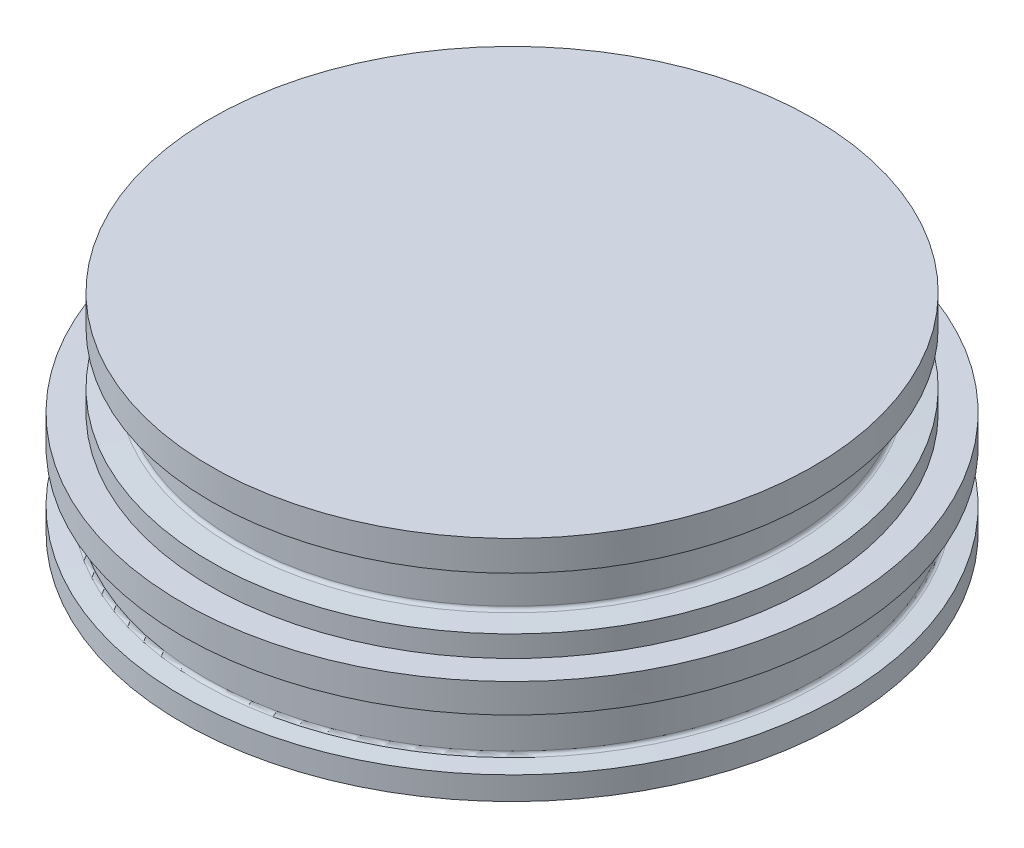
ISO-10303-21;
HEADER;
FILE_DESCRIPTION(('STEP AP214'),'2;1');
FILE_NAME('part.step','',(''),(''),'','','');
FILE_SCHEMA(('AUTOMOTIVE_DESIGN { 1 0 10303 214 1 1 1 1 }'));
ENDSEC;
DATA;
#1=APPLICATION_CONTEXT('core data for automotive mechanical design processes');
#2=APPLICATION_PROTOCOL_DEFINITION('international standard','automotive_design',2000,#1);
#3=PRODUCT_CONTEXT('',#1,'mechanical');
#4=PRODUCT('Part','Part','',(#3));
#5=PRODUCT_RELATED_PRODUCT_CATEGORY('part','',(#4));
#6=PRODUCT_DEFINITION_FORMATION('','',#4);
#7=PRODUCT_DEFINITION_CONTEXT('part definition',#1,'design');
#8=PRODUCT_DEFINITION('design','',#6,#7);
#9=PRODUCT_DEFINITION_SHAPE('','',#8);
#10=(LENGTH_UNIT() NAMED_UNIT(*) SI_UNIT(.MILLI.,.METRE.));
#11=(NAMED_UNIT(*) PLANE_ANGLE_UNIT() SI_UNIT($,.RADIAN.));
#12=(NAMED_UNIT(*) SI_UNIT($,.STERADIAN.) SOLID_ANGLE_UNIT());
#13=UNCERTAINTY_MEASURE_WITH_UNIT(LENGTH_MEASURE(1.E-05),#10,'distance_accuracy_value','');
#14=(GEOMETRIC_REPRESENTATION_CONTEXT(3) GLOBAL_UNCERTAINTY_ASSIGNED_CONTEXT((#13)) GLOBAL_UNIT_ASSIGNED_CONTEXT((#10,
#11,#12)) REPRESENTATION_CONTEXT('',''));
#15=CARTESIAN_POINT('',(0.,0.,0.));
#16=DIRECTION('',(0.,0.,1.));
#17=DIRECTION('',(1.,0.,0.));
#18=AXIS2_PLACEMENT_3D('',#15,#16,#17);
#19=CARTESIAN_POINT('',(0.,0.,0.));
#20=DIRECTION('',(0.,-1.,0.));
#21=DIRECTION('',(0.,0.,-1.));
#22=AXIS2_PLACEMENT_3D('',#19,#20,#21);
#23=CYLINDRICAL_SURFACE('',#22,22.0853);
#24=CARTESIAN_POINT('',(0.,-6.06148321730033,0.));
#25=DIRECTION('',(0.,-1.,0.));
#26=DIRECTION('',(0.,0.,-1.));
#27=AXIS2_PLACEMENT_3D('',#24,#25,#26);
#28=CIRCLE('',#27,22.0853);
#29=CARTESIAN_POINT('',(0.,-6.06148321730033,-22.0853));
#30=VERTEX_POINT('',#29);
#31=EDGE_CURVE('E39',#30,#30,#28,.T.);
#32=ORIENTED_EDGE('',*,*,#31,.T.);
#33=EDGE_LOOP('',(#32));
#34=FACE_BOUND('',#33,.T.);
#35=CARTESIAN_POINT('',(0.,-7.62,0.));
#36=DIRECTION('',(0.,-1.,0.));
#37=DIRECTION('',(0.,0.,-1.));
#38=AXIS2_PLACEMENT_3D('',#35,#36,#37);
#39=CIRCLE('',#38,22.0853);
#40=CARTESIAN_POINT('',(0.,-7.62,-22.0853));
#41=VERTEX_POINT('',#40);
#42=EDGE_CURVE('E43',#41,#41,#39,.T.);
#43=ORIENTED_EDGE('',*,*,#42,.F.);
#44=EDGE_LOOP('',(#43));
#45=FACE_BOUND('',#44,.T.);
#46=ADVANCED_FACE('F35',(#34,#45),#23,.T.);
#47=CARTESIAN_POINT('',(-22.0853,-7.62,0.));
#48=DIRECTION('',(0.,-1.,0.));
#49=DIRECTION('',(0.,0.,-1.));
#50=AXIS2_PLACEMENT_3D('',#47,#48,#49);
#51=PLANE('',#50);
#52=CARTESIAN_POINT('',(0.,-7.62,0.));
#53=DIRECTION('',(0.,-1.,0.));
#54=DIRECTION('',(0.,0.,-1.));
#55=AXIS2_PLACEMENT_3D('',#52,#53,#54);
#56=CIRCLE('',#55,24.1554);
#57=CARTESIAN_POINT('',(0.,-7.62,-24.1554));
#58=VERTEX_POINT('',#57);
#59=EDGE_CURVE('E48',#58,#58,#56,.T.);
#60=ORIENTED_EDGE('',*,*,#59,.F.);
#61=EDGE_LOOP('',(#60));
#62=FACE_BOUND('',#61,.T.);
#63=ORIENTED_EDGE('',*,*,#42,.T.);
#64=EDGE_LOOP('',(#63));
#65=FACE_BOUND('',#64,.T.);
#66=ADVANCED_FACE('F92',(#62,#65),#51,.F.);
#67=CARTESIAN_POINT('',(0.,0.,0.));
#68=DIRECTION('',(0.,-1.,0.));
#69=DIRECTION('',(0.,0.,-1.));
#70=AXIS2_PLACEMENT_3D('',#67,#68,#69);
#71=CYLINDRICAL_SURFACE('',#70,24.1554);
#72=CARTESIAN_POINT('',(0.,-9.74820445114807,0.));
#73=DIRECTION('',(0.,1.,0.));
#74=DIRECTION('',(0.,0.,1.));
#75=AXIS2_PLACEMENT_3D('',#72,#73,#74);
#76=CIRCLE('',#75,24.1554);
#77=CARTESIAN_POINT('',(0.,-9.74820445114807,24.1554));
#78=VERTEX_POINT('',#77);
#79=EDGE_CURVE('E52',#78,#78,#76,.T.);
#80=ORIENTED_EDGE('',*,*,#79,.T.);
#81=EDGE_LOOP('',(#80));
#82=FACE_BOUND('',#81,.T.);
#83=ORIENTED_EDGE('',*,*,#59,.T.);
#84=EDGE_LOOP('',(#83));
#85=FACE_BOUND('',#84,.T.);
#86=ADVANCED_FACE('F90',(#82,#85),#71,.T.);
#87=CARTESIAN_POINT('',(0.,-13.592521164845,0.));
#88=DIRECTION('',(0.,-1.,0.));
#89=DIRECTION('',(0.,0.,-1.));
#90=AXIS2_PLACEMENT_3D('',#87,#88,#89);
#91=CONICAL_SURFACE('',#90,24.6888,1.48352986419518);
#92=CARTESIAN_POINT('',(0.,-13.4250295814342,0.));
#93=DIRECTION('',(0.,1.,0.));
#94=DIRECTION('',(0.,0.,1.));
#95=AXIS2_PLACEMENT_3D('',#92,#93,#94);
#96=CIRCLE('',#95,22.7743624413421);
#97=CARTESIAN_POINT('',(0.,-13.4250295814342,22.7743624413421));
#98=VERTEX_POINT('',#97);
#99=EDGE_CURVE('E56',#98,#98,#96,.T.);
#100=ORIENTED_EDGE('',*,*,#99,.F.);
#101=EDGE_LOOP('',(#100));
#102=FACE_BOUND('',#101,.T.);
#103=CARTESIAN_POINT('',(0.,-13.5458547117202,0.));
#104=DIRECTION('',(0.,-1.,0.));
#105=DIRECTION('',(0.,0.,-1.));
#106=AXIS2_PLACEMENT_3D('',#103,#104,#105);
#107=CIRCLE('',#106,24.1554);
#108=CARTESIAN_POINT('',(0.,-13.5458547117202,-24.1554));
#109=VERTEX_POINT('',#108);
#110=EDGE_CURVE('E55',#109,#109,#107,.T.);
#111=ORIENTED_EDGE('',*,*,#110,.F.);
#112=EDGE_LOOP('',(#111));
#113=FACE_BOUND('',#112,.T.);
#114=ADVANCED_FACE('F149',(#102,#113),#91,.T.);
#115=CARTESIAN_POINT('',(0.,-9.86902958143415,0.));
#116=DIRECTION('',(0.,1.,0.));
#117=DIRECTION('',(0.,0.,1.));
#118=AXIS2_PLACEMENT_3D('',#115,#116,#117);
#119=CONICAL_SURFACE('',#118,22.7743624413421,1.48352986419518);
#120=CARTESIAN_POINT('',(0.,-9.86902958143415,0.));
#121=DIRECTION('',(0.,1.,0.));
#122=DIRECTION('',(0.,0.,1.));
#123=AXIS2_PLACEMENT_3D('',#120,#121,#122);
#124=CIRCLE('',#123,22.7743624413421);
#125=CARTESIAN_POINT('',(0.,-9.86902958143415,22.7743624413421));
#126=VERTEX_POINT('',#125);
#127=EDGE_CURVE('E81',#126,#126,#124,.T.);
#128=ORIENTED_EDGE('',*,*,#127,.T.);
#129=EDGE_LOOP('',(#128));
#130=FACE_BOUND('',#129,.T.);
#131=ORIENTED_EDGE('',*,*,#79,.F.);
#132=EDGE_LOOP('',(#131));
#133=FACE_BOUND('',#132,.T.);
#134=ADVANCED_FACE('F146',(#130,#133),#119,.T.);
#135=CARTESIAN_POINT('',(0.,-13.1719961281189,0.));
#136=DIRECTION('',(0.,1.,0.));
#137=DIRECTION('',(0.,0.,1.));
#138=AXIS2_PLACEMENT_3D('',#135,#136,#137);
#139=TOROIDAL_SURFACE('',#138,22.7965,0.254);
#140=CARTESIAN_POINT('',(0.,-13.1719961281189,0.));
#141=DIRECTION('',(0.,1.,0.));
#142=DIRECTION('',(0.,0.,1.));
#143=AXIS2_PLACEMENT_3D('',#140,#141,#142);
#144=CIRCLE('',#143,22.5425);
#145=CARTESIAN_POINT('',(0.,-13.1719961281189,22.5425));
#146=VERTEX_POINT('',#145);
#147=EDGE_CURVE('E65',#146,#146,#144,.T.);
#148=ORIENTED_EDGE('',*,*,#147,.F.);
#149=EDGE_LOOP('',(#148));
#150=FACE_BOUND('',#149,.T.);
#151=ORIENTED_EDGE('',*,*,#99,.T.);
#152=EDGE_LOOP('',(#151));
#153=FACE_BOUND('',#152,.T.);
#154=ADVANCED_FACE('F144',(#150,#153),#139,.F.);
#155=CARTESIAN_POINT('',(0.,-10.1220630347495,0.));
#156=DIRECTION('',(0.,1.,0.));
#157=DIRECTION('',(0.,0.,1.));
#158=AXIS2_PLACEMENT_3D('',#155,#156,#157);
#159=TOROIDAL_SURFACE('',#158,22.7965,0.254);
#160=ORIENTED_EDGE('',*,*,#127,.F.);
#161=EDGE_LOOP('',(#160));
#162=FACE_BOUND('',#161,.T.);
#163=CARTESIAN_POINT('',(0.,-10.1220630347495,0.));
#164=DIRECTION('',(0.,1.,0.));
#165=DIRECTION('',(0.,0.,1.));
#166=AXIS2_PLACEMENT_3D('',#163,#164,#165);
#167=CIRCLE('',#166,22.5425);
#168=CARTESIAN_POINT('',(0.,-10.1220630347495,22.5425));
#169=VERTEX_POINT('',#168);
#170=EDGE_CURVE('E78',#169,#169,#167,.T.);
#171=ORIENTED_EDGE('',*,*,#170,.T.);
#172=EDGE_LOOP('',(#171));
#173=FACE_BOUND('',#172,.T.);
#174=ADVANCED_FACE('F140',(#162,#173),#159,.F.);
#175=CARTESIAN_POINT('',(0.,-50.,0.));
#176=DIRECTION('',(0.,1.,0.));
#177=DIRECTION('',(0.,0.,1.));
#178=AXIS2_PLACEMENT_3D('',#175,#176,#177);
#179=CYLINDRICAL_SURFACE('',#178,22.5425);
#180=ORIENTED_EDGE('',*,*,#170,.F.);
#181=EDGE_LOOP('',(#180));
#182=FACE_BOUND('',#181,.T.);
#183=ORIENTED_EDGE('',*,*,#147,.T.);
#184=EDGE_LOOP('',(#183));
#185=FACE_BOUND('',#184,.T.);
#186=ADVANCED_FACE('F136',(#182,#185),#179,.T.);
#187=CARTESIAN_POINT('',(-24.1554,-15.24,0.));
#188=DIRECTION('',(0.,1.,0.));
#189=DIRECTION('',(0.,0.,1.));
#190=AXIS2_PLACEMENT_3D('',#187,#188,#189);
#191=PLANE('',#190);
#192=CARTESIAN_POINT('',(0.,-15.24,0.));
#193=DIRECTION('',(0.,-1.,0.));
#194=DIRECTION('',(0.,0.,-1.));
#195=AXIS2_PLACEMENT_3D('',#192,#193,#194);
#196=CIRCLE('',#195,24.1554);
#197=CARTESIAN_POINT('',(0.,-15.24,-24.1554));
#198=VERTEX_POINT('',#197);
#199=EDGE_CURVE('E58',#198,#198,#196,.T.);
#200=ORIENTED_EDGE('',*,*,#199,.T.);
#201=EDGE_LOOP('',(#200));
#202=FACE_BOUND('',#201,.T.);
#203=ADVANCED_FACE('F139',(#202),#191,.F.);
#204=ORIENTED_EDGE('',*,*,#110,.T.);
#205=EDGE_LOOP('',(#204));
#206=FACE_BOUND('',#205,.T.);
#207=ORIENTED_EDGE('',*,*,#199,.F.);
#208=EDGE_LOOP('',(#207));
#209=FACE_BOUND('',#208,.T.);
#210=ADVANCED_FACE('F131',(#206,#209),#71,.T.);
#211=CARTESIAN_POINT('',(0.,-6.08148312578236,0.));
#212=DIRECTION('',(0.,-1.,0.));
#213=DIRECTION('',(0.,0.,-1.));
#214=AXIS2_PLACEMENT_3D('',#211,#212,#213);
#215=CONICAL_SURFACE('',#214,22.3139,1.48352986419518);
#216=CARTESIAN_POINT('',(0.,-5.91399154237154,0.));
#217=DIRECTION('',(0.,1.,0.));
#218=DIRECTION('',(0.,0.,1.));
#219=AXIS2_PLACEMENT_3D('',#216,#217,#218);
#220=CIRCLE('',#219,20.3994624413421);
#221=CARTESIAN_POINT('',(0.,-5.91399154237154,20.3994624413421));
#222=VERTEX_POINT('',#221);
#223=EDGE_CURVE('E61',#222,#222,#220,.T.);
#224=ORIENTED_EDGE('',*,*,#223,.F.);
#225=EDGE_LOOP('',(#224));
#226=FACE_BOUND('',#225,.T.);
#227=ORIENTED_EDGE('',*,*,#31,.F.);
#228=EDGE_LOOP('',(#227));
#229=FACE_BOUND('',#228,.T.);
#230=ADVANCED_FACE('F127',(#226,#229),#215,.T.);
#231=CARTESIAN_POINT('',(0.,-2.35799154237154,0.));
#232=DIRECTION('',(0.,1.,0.));
#233=DIRECTION('',(0.,0.,1.));
#234=AXIS2_PLACEMENT_3D('',#231,#232,#233);
#235=CONICAL_SURFACE('',#234,20.3994624413421,1.48352986419518);
#236=CARTESIAN_POINT('',(0.,-2.35799154237154,0.));
#237=DIRECTION('',(0.,1.,0.));
#238=DIRECTION('',(0.,0.,1.));
#239=AXIS2_PLACEMENT_3D('',#236,#237,#238);
#240=CIRCLE('',#239,20.3994624413421);
#241=CARTESIAN_POINT('',(0.,-2.35799154237154,20.3994624413421));
#242=VERTEX_POINT('',#241);
#243=EDGE_CURVE('E67',#242,#242,#240,.T.);
#244=ORIENTED_EDGE('',*,*,#243,.T.);
#245=EDGE_LOOP('',(#244));
#246=FACE_BOUND('',#245,.T.);
#247=CARTESIAN_POINT('',(0.,-2.21049986744275,0.));
#248=DIRECTION('',(0.,1.,0.));
#249=DIRECTION('',(0.,0.,1.));
#250=AXIS2_PLACEMENT_3D('',#247,#248,#249);
#251=CIRCLE('',#250,22.0853);
#252=CARTESIAN_POINT('',(0.,-2.21049986744275,22.0853));
#253=VERTEX_POINT('',#252);
#254=EDGE_CURVE('E59',#253,#253,#251,.T.);
#255=ORIENTED_EDGE('',*,*,#254,.F.);
#256=EDGE_LOOP('',(#255));
#257=FACE_BOUND('',#256,.T.);
#258=ADVANCED_FACE('F124',(#246,#257),#235,.T.);
#259=CARTESIAN_POINT('',(0.,-5.66095808905624,0.));
#260=DIRECTION('',(0.,1.,0.));
#261=DIRECTION('',(0.,0.,1.));
#262=AXIS2_PLACEMENT_3D('',#259,#260,#261);
#263=TOROIDAL_SURFACE('',#262,20.4216,0.254000000000001);
#264=CARTESIAN_POINT('',(0.,-5.66095808905624,0.));
#265=DIRECTION('',(0.,1.,0.));
#266=DIRECTION('',(0.,0.,1.));
#267=AXIS2_PLACEMENT_3D('',#264,#265,#266);
#268=CIRCLE('',#267,20.1676);
#269=CARTESIAN_POINT('',(0.,-5.66095808905624,20.1676));
#270=VERTEX_POINT('',#269);
#271=EDGE_CURVE('E273',#270,#270,#268,.T.);
#272=ORIENTED_EDGE('',*,*,#271,.F.);
#273=EDGE_LOOP('',(#272));
#274=FACE_BOUND('',#273,.T.);
#275=ORIENTED_EDGE('',*,*,#223,.T.);
#276=EDGE_LOOP('',(#275));
#277=FACE_BOUND('',#276,.T.);
#278=ADVANCED_FACE('F118',(#274,#277),#263,.F.);
#279=CARTESIAN_POINT('',(0.,-2.61102499568684,0.));
#280=DIRECTION('',(0.,1.,0.));
#281=DIRECTION('',(0.,0.,1.));
#282=AXIS2_PLACEMENT_3D('',#279,#280,#281);
#283=TOROIDAL_SURFACE('',#282,20.4216,0.254000000000001);
#284=ORIENTED_EDGE('',*,*,#243,.F.);
#285=EDGE_LOOP('',(#284));
#286=FACE_BOUND('',#285,.T.);
#287=CARTESIAN_POINT('',(0.,-2.61102499568684,0.));
#288=DIRECTION('',(0.,1.,0.));
#289=DIRECTION('',(0.,0.,1.));
#290=AXIS2_PLACEMENT_3D('',#287,#288,#289);
#291=CIRCLE('',#290,20.1676);
#292=CARTESIAN_POINT('',(0.,-2.61102499568684,20.1676));
#293=VERTEX_POINT('',#292);
#294=EDGE_CURVE('E72',#293,#293,#291,.T.);
#295=ORIENTED_EDGE('',*,*,#294,.T.);
#296=EDGE_LOOP('',(#295));
#297=FACE_BOUND('',#296,.T.);
#298=ADVANCED_FACE('F112',(#286,#297),#283,.F.);
#299=CARTESIAN_POINT('',(0.,-50.,0.));
#300=DIRECTION('',(0.,1.,0.));
#301=DIRECTION('',(0.,0.,1.));
#302=AXIS2_PLACEMENT_3D('',#299,#300,#301);
#303=CYLINDRICAL_SURFACE('',#302,20.1676);
#304=ORIENTED_EDGE('',*,*,#294,.F.);
#305=EDGE_LOOP('',(#304));
#306=FACE_BOUND('',#305,.T.);
#307=ORIENTED_EDGE('',*,*,#271,.T.);
#308=EDGE_LOOP('',(#307));
#309=FACE_BOUND('',#308,.T.);
#310=ADVANCED_FACE('F107',(#306,#309),#303,.T.);
#311=CARTESIAN_POINT('',(-22.0853,0.,0.));
#312=DIRECTION('',(0.,-1.,0.));
#313=DIRECTION('',(0.,0.,-1.));
#314=AXIS2_PLACEMENT_3D('',#311,#312,#313);
#315=PLANE('',#314);
#316=CARTESIAN_POINT('',(0.,0.,0.));
#317=DIRECTION('',(0.,-1.,0.));
#318=DIRECTION('',(0.,0.,-1.));
#319=AXIS2_PLACEMENT_3D('',#316,#317,#318);
#320=CIRCLE('',#319,22.0853);
#321=CARTESIAN_POINT('',(0.,0.,-22.0853));
#322=VERTEX_POINT('',#321);
#323=EDGE_CURVE('E10',#322,#322,#320,.T.);
#324=ORIENTED_EDGE('',*,*,#323,.F.);
#325=EDGE_LOOP('',(#324));
#326=FACE_BOUND('',#325,.T.);
#327=ADVANCED_FACE('F37',(#326),#315,.F.);
#328=ORIENTED_EDGE('',*,*,#254,.T.);
#329=EDGE_LOOP('',(#328));
#330=FACE_BOUND('',#329,.T.);
#331=ORIENTED_EDGE('',*,*,#323,.T.);
#332=EDGE_LOOP('',(#331));
#333=FACE_BOUND('',#332,.T.);
#334=ADVANCED_FACE('F100',(#330,#333),#23,.T.);
#335=CLOSED_SHELL('',(#46,#66,#86,#114,#134,#154,#174,#186,#203,#210,#230,#258,#278,#298,#310,
#327,#334));
#336=MANIFOLD_SOLID_BREP('B2',#335);
#337=ADVANCED_BREP_SHAPE_REPRESENTATION('',(#18,#336),#14);
#338=SHAPE_DEFINITION_REPRESENTATION(#9,#337);
ENDSEC;
END-ISO-10303-21;
